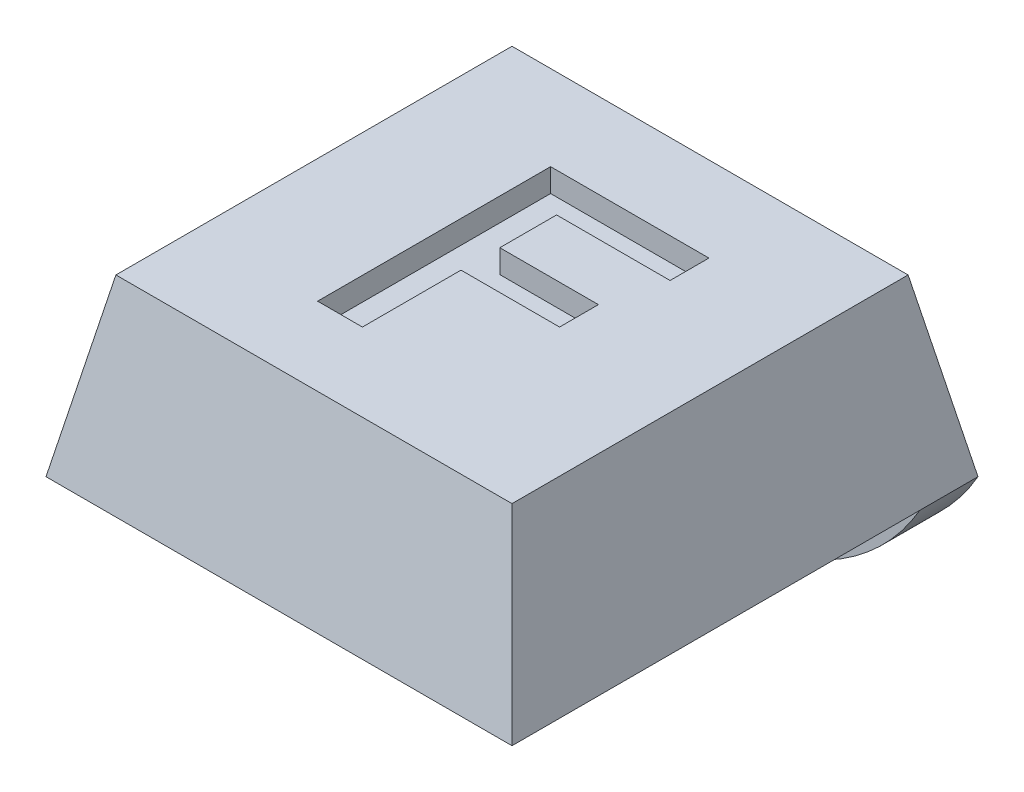
ISO-10303-21;
HEADER;
FILE_DESCRIPTION(('STEP AP214'),'2;1');
FILE_NAME('part.step','',(''),(''),'','','');
FILE_SCHEMA(('AUTOMOTIVE_DESIGN { 1 0 10303 214 1 1 1 1 }'));
ENDSEC;
DATA;
#1=APPLICATION_CONTEXT('core data for automotive mechanical design processes');
#2=APPLICATION_PROTOCOL_DEFINITION('international standard','automotive_design',2000,#1);
#3=PRODUCT_CONTEXT('',#1,'mechanical');
#4=PRODUCT('Part','Part','',(#3));
#5=PRODUCT_RELATED_PRODUCT_CATEGORY('part','',(#4));
#6=PRODUCT_DEFINITION_FORMATION('','',#4);
#7=PRODUCT_DEFINITION_CONTEXT('part definition',#1,'design');
#8=PRODUCT_DEFINITION('design','',#6,#7);
#9=PRODUCT_DEFINITION_SHAPE('','',#8);
#10=(LENGTH_UNIT() NAMED_UNIT(*) SI_UNIT(.MILLI.,.METRE.));
#11=(NAMED_UNIT(*) PLANE_ANGLE_UNIT() SI_UNIT($,.RADIAN.));
#12=(NAMED_UNIT(*) SI_UNIT($,.STERADIAN.) SOLID_ANGLE_UNIT());
#13=UNCERTAINTY_MEASURE_WITH_UNIT(LENGTH_MEASURE(1.E-05),#10,'distance_accuracy_value','');
#14=(GEOMETRIC_REPRESENTATION_CONTEXT(3) GLOBAL_UNCERTAINTY_ASSIGNED_CONTEXT((#13)) GLOBAL_UNIT_ASSIGNED_CONTEXT((#10,
#11,#12)) REPRESENTATION_CONTEXT('',''));
#15=CARTESIAN_POINT('',(0.,0.,0.));
#16=DIRECTION('',(0.,0.,1.));
#17=DIRECTION('',(1.,0.,0.));
#18=AXIS2_PLACEMENT_3D('',#15,#16,#17);
#19=CARTESIAN_POINT('',(0.,3.,0.));
#20=DIRECTION('',(0.,-1.,0.));
#21=DIRECTION('',(0.,0.,-1.));
#22=AXIS2_PLACEMENT_3D('',#19,#20,#21);
#23=PLANE('',#22);
#24=DIRECTION('',(-1.,0.,0.));
#25=VECTOR('',#24,1.);
#26=CARTESIAN_POINT('',(11.,3.,-0.6));
#27=LINE('',#26,#25);
#28=CARTESIAN_POINT('',(7.4,3.,-0.6));
#29=VERTEX_POINT('',#28);
#30=CARTESIAN_POINT('',(0.6,3.,-0.6));
#31=VERTEX_POINT('',#30);
#32=EDGE_CURVE('E217',#29,#31,#27,.T.);
#33=ORIENTED_EDGE('',*,*,#32,.F.);
#34=DIRECTION('',(0.,0.,1.));
#35=VECTOR('',#34,1.);
#36=CARTESIAN_POINT('',(7.4,3.,-8.));
#37=LINE('',#36,#35);
#38=CARTESIAN_POINT('',(7.4,3.,-7.4));
#39=VERTEX_POINT('',#38);
#40=EDGE_CURVE('E230',#39,#29,#37,.T.);
#41=ORIENTED_EDGE('',*,*,#40,.F.);
#42=DIRECTION('',(-1.,0.,0.));
#43=VECTOR('',#42,1.);
#44=CARTESIAN_POINT('',(11.,3.,-7.4));
#45=LINE('',#44,#43);
#46=CARTESIAN_POINT('',(0.599999999999999,3.,-7.4));
#47=VERTEX_POINT('',#46);
#48=EDGE_CURVE('E213',#39,#47,#45,.T.);
#49=ORIENTED_EDGE('',*,*,#48,.T.);
#50=DIRECTION('',(0.,0.,1.));
#51=VECTOR('',#50,1.);
#52=CARTESIAN_POINT('',(0.6,3.,-8.));
#53=LINE('',#52,#51);
#54=EDGE_CURVE('E233',#47,#31,#53,.T.);
#55=ORIENTED_EDGE('',*,*,#54,.T.);
#56=EDGE_LOOP('',(#33,#41,#49,#55));
#57=FACE_BOUND('',#56,.T.);
#58=DIRECTION('',(-1.,0.,0.));
#59=VECTOR('',#58,1.);
#60=CARTESIAN_POINT('',(3.49080595744267,3.,-1.94116936627452));
#61=LINE('',#60,#59);
#62=CARTESIAN_POINT('',(3.49080595744267,3.,-1.94116936627452));
#63=VERTEX_POINT('',#62);
#64=CARTESIAN_POINT('',(2.7215751882119,3.,-1.94116936627452));
#65=VERTEX_POINT('',#64);
#66=EDGE_CURVE('E58',#63,#65,#61,.T.);
#67=ORIENTED_EDGE('',*,*,#66,.T.);
#68=DIRECTION('',(0.,0.,-1.));
#69=VECTOR('',#68,1.);
#70=CARTESIAN_POINT('',(2.7215751882119,3.,-1.94116936627452));
#71=LINE('',#70,#69);
#72=CARTESIAN_POINT('',(2.7215751882119,3.,-5.94116936627452));
#73=VERTEX_POINT('',#72);
#74=EDGE_CURVE('E185',#65,#73,#71,.T.);
#75=ORIENTED_EDGE('',*,*,#74,.T.);
#76=DIRECTION('',(1.,0.,0.));
#77=VECTOR('',#76,1.);
#78=CARTESIAN_POINT('',(2.7215751882119,3.,-5.94116936627452));
#79=LINE('',#78,#77);
#80=CARTESIAN_POINT('',(5.43952390616062,3.,-5.94116936627452));
#81=VERTEX_POINT('',#80);
#82=EDGE_CURVE('E624',#73,#81,#79,.T.);
#83=ORIENTED_EDGE('',*,*,#82,.T.);
#84=DIRECTION('',(0.,0.,1.));
#85=VECTOR('',#84,1.);
#86=CARTESIAN_POINT('',(5.43952390616062,3.,-5.94116936627452));
#87=LINE('',#86,#85);
#88=CARTESIAN_POINT('',(5.43952390616062,3.,-5.27450269960785));
#89=VERTEX_POINT('',#88);
#90=EDGE_CURVE('E626',#81,#89,#87,.T.);
#91=ORIENTED_EDGE('',*,*,#90,.T.);
#92=DIRECTION('',(-1.,0.,0.));
#93=VECTOR('',#92,1.);
#94=CARTESIAN_POINT('',(5.43952390616062,3.,-5.27450269960785));
#95=LINE('',#94,#93);
#96=CARTESIAN_POINT('',(3.49080595744267,3.,-5.27450269960785));
#97=VERTEX_POINT('',#96);
#98=EDGE_CURVE('E631',#89,#97,#95,.T.);
#99=ORIENTED_EDGE('',*,*,#98,.T.);
#100=DIRECTION('',(0.,0.,1.));
#101=VECTOR('',#100,1.);
#102=CARTESIAN_POINT('',(3.49080595744267,3.,-5.27450269960785));
#103=LINE('',#102,#101);
#104=CARTESIAN_POINT('',(3.49080595744267,3.,-4.30014372524888));
#105=VERTEX_POINT('',#104);
#106=EDGE_CURVE('E641',#97,#105,#103,.T.);
#107=ORIENTED_EDGE('',*,*,#106,.T.);
#108=DIRECTION('',(1.,0.,0.));
#109=VECTOR('',#108,1.);
#110=CARTESIAN_POINT('',(3.49080595744267,3.,-4.30014372524888));
#111=LINE('',#110,#109);
#112=CARTESIAN_POINT('',(5.18311364975036,3.,-4.30014372524888));
#113=VERTEX_POINT('',#112);
#114=EDGE_CURVE('E596',#105,#113,#111,.T.);
#115=ORIENTED_EDGE('',*,*,#114,.T.);
#116=DIRECTION('',(0.,0.,1.));
#117=VECTOR('',#116,1.);
#118=CARTESIAN_POINT('',(5.18311364975036,3.,-4.30014372524888));
#119=LINE('',#118,#117);
#120=CARTESIAN_POINT('',(5.18311364975036,3.,-3.63347705858221));
#121=VERTEX_POINT('',#120);
#122=EDGE_CURVE('E591',#113,#121,#119,.T.);
#123=ORIENTED_EDGE('',*,*,#122,.T.);
#124=DIRECTION('',(-1.,0.,0.));
#125=VECTOR('',#124,1.);
#126=CARTESIAN_POINT('',(5.18311364975036,3.,-3.63347705858221));
#127=LINE('',#126,#125);
#128=CARTESIAN_POINT('',(3.49080595744267,3.,-3.63347705858221));
#129=VERTEX_POINT('',#128);
#130=EDGE_CURVE('E585',#121,#129,#127,.T.);
#131=ORIENTED_EDGE('',*,*,#130,.T.);
#132=DIRECTION('',(0.,0.,1.));
#133=VECTOR('',#132,1.);
#134=CARTESIAN_POINT('',(3.49080595744267,3.,-3.63347705858221));
#135=LINE('',#134,#133);
#136=EDGE_CURVE('E181',#129,#63,#135,.T.);
#137=ORIENTED_EDGE('',*,*,#136,.T.);
#138=EDGE_LOOP('',(#67,#75,#83,#91,#99,#107,#115,#123,#131,#137));
#139=FACE_BOUND('',#138,.T.);
#140=ADVANCED_FACE('F42',(#57,#139),#23,.F.);
#141=CARTESIAN_POINT('',(8.,0.,-8.));
#142=DIRECTION('',(-0.98058067569092,-0.196116135138184,0.));
#143=DIRECTION('',(0.196116135138184,-0.98058067569092,0.));
#144=AXIS2_PLACEMENT_3D('',#141,#142,#143);
#145=PLANE('',#144);
#146=DIRECTION('',(-0.192450089729875,0.962250448649376,-0.192450089729875));
#147=VECTOR('',#146,1.);
#148=CARTESIAN_POINT('',(7.7037037037037,1.48148148148148,-0.296296296296296));
#149=LINE('',#148,#147);
#150=CARTESIAN_POINT('',(8.,0.,0.));
#151=VERTEX_POINT('',#150);
#152=EDGE_CURVE('E227',#151,#29,#149,.T.);
#153=ORIENTED_EDGE('',*,*,#152,.F.);
#154=DIRECTION('',(0.,0.,-1.));
#155=VECTOR('',#154,1.);
#156=CARTESIAN_POINT('',(8.,0.,0.));
#157=LINE('',#156,#155);
#158=CARTESIAN_POINT('',(8.,0.,-7.));
#159=VERTEX_POINT('',#158);
#160=EDGE_CURVE('E246',#151,#159,#157,.T.);
#161=ORIENTED_EDGE('',*,*,#160,.T.);
#162=DIRECTION('',(0.,0.,1.));
#163=VECTOR('',#162,1.);
#164=CARTESIAN_POINT('',(8.,0.,-8.));
#165=LINE('',#164,#163);
#166=CARTESIAN_POINT('',(8.,0.,-8.));
#167=VERTEX_POINT('',#166);
#168=EDGE_CURVE('E187',#167,#159,#165,.T.);
#169=ORIENTED_EDGE('',*,*,#168,.F.);
#170=DIRECTION('',(0.192450089729875,-0.962250448649376,-0.192450089729875));
#171=VECTOR('',#170,1.);
#172=CARTESIAN_POINT('',(8.,0.,-8.));
#173=LINE('',#172,#171);
#174=EDGE_CURVE('E220',#39,#167,#173,.T.);
#175=ORIENTED_EDGE('',*,*,#174,.F.);
#176=ORIENTED_EDGE('',*,*,#40,.T.);
#177=EDGE_LOOP('',(#153,#161,#169,#175,#176));
#178=FACE_BOUND('',#177,.T.);
#179=ADVANCED_FACE('F314',(#178),#145,.F.);
#180=CARTESIAN_POINT('',(0.,0.,-8.));
#181=DIRECTION('',(0.98058067569092,-0.196116135138184,0.));
#182=DIRECTION('',(0.196116135138184,0.98058067569092,0.));
#183=AXIS2_PLACEMENT_3D('',#180,#181,#182);
#184=PLANE('',#183);
#185=DIRECTION('',(-0.192450089729875,-0.962250448649376,0.192450089729875));
#186=VECTOR('',#185,1.);
#187=CARTESIAN_POINT('',(0.296296296296296,1.48148148148148,-0.296296296296296));
#188=LINE('',#187,#186);
#189=CARTESIAN_POINT('',(0.,0.,0.));
#190=VERTEX_POINT('',#189);
#191=EDGE_CURVE('E274',#31,#190,#188,.T.);
#192=ORIENTED_EDGE('',*,*,#191,.F.);
#193=ORIENTED_EDGE('',*,*,#54,.F.);
#194=DIRECTION('',(0.192450089729875,0.962250448649376,0.192450089729875));
#195=VECTOR('',#194,1.);
#196=CARTESIAN_POINT('',(0.,0.,-8.));
#197=LINE('',#196,#195);
#198=CARTESIAN_POINT('',(0.,0.,-8.));
#199=VERTEX_POINT('',#198);
#200=EDGE_CURVE('E245',#199,#47,#197,.T.);
#201=ORIENTED_EDGE('',*,*,#200,.F.);
#202=DIRECTION('',(0.,0.,1.));
#203=VECTOR('',#202,1.);
#204=CARTESIAN_POINT('',(0.,0.,0.));
#205=LINE('',#204,#203);
#206=CARTESIAN_POINT('',(0.,0.,-7.));
#207=VERTEX_POINT('',#206);
#208=EDGE_CURVE('E250',#199,#207,#205,.T.);
#209=ORIENTED_EDGE('',*,*,#208,.T.);
#210=EDGE_CURVE('E237',#207,#190,#205,.T.);
#211=ORIENTED_EDGE('',*,*,#210,.T.);
#212=EDGE_LOOP('',(#192,#193,#201,#209,#211));
#213=FACE_BOUND('',#212,.T.);
#214=ADVANCED_FACE('F298',(#213),#184,.F.);
#215=CARTESIAN_POINT('',(0.,0.,0.));
#216=DIRECTION('',(0.,-1.,0.));
#217=DIRECTION('',(0.,0.,-1.));
#218=AXIS2_PLACEMENT_3D('',#215,#216,#217);
#219=PLANE('',#218);
#220=DIRECTION('',(-1.,0.,0.));
#221=VECTOR('',#220,1.);
#222=CARTESIAN_POINT('',(0.,0.,-7.));
#223=LINE('',#222,#221);
#224=EDGE_CURVE('E193',#159,#207,#223,.T.);
#225=ORIENTED_EDGE('',*,*,#224,.F.);
#226=ORIENTED_EDGE('',*,*,#160,.F.);
#227=DIRECTION('',(1.,0.,0.));
#228=VECTOR('',#227,1.);
#229=CARTESIAN_POINT('',(0.,0.,0.));
#230=LINE('',#229,#228);
#231=EDGE_CURVE('E247',#190,#151,#230,.T.);
#232=ORIENTED_EDGE('',*,*,#231,.F.);
#233=ORIENTED_EDGE('',*,*,#210,.F.);
#234=EDGE_LOOP('',(#225,#226,#232,#233));
#235=FACE_BOUND('',#234,.T.);
#236=CARTESIAN_POINT('',(4.,0.,-3.75));
#237=DIRECTION('',(0.,-1.,0.));
#238=DIRECTION('',(0.,0.,-1.));
#239=AXIS2_PLACEMENT_3D('',#236,#237,#238);
#240=CIRCLE('',#239,1.8);
#241=CARTESIAN_POINT('',(4.,0.,-5.55));
#242=VERTEX_POINT('',#241);
#243=EDGE_CURVE('E205',#242,#242,#240,.T.);
#244=ORIENTED_EDGE('',*,*,#243,.F.);
#245=EDGE_LOOP('',(#244));
#246=FACE_BOUND('',#245,.T.);
#247=ADVANCED_FACE('F309',(#235,#246),#219,.T.);
#248=CARTESIAN_POINT('',(11.,3.,-7.4));
#249=DIRECTION('',(0.,0.196116135138184,-0.98058067569092));
#250=DIRECTION('',(0.,0.98058067569092,0.196116135138184));
#251=AXIS2_PLACEMENT_3D('',#248,#249,#250);
#252=PLANE('',#251);
#253=ORIENTED_EDGE('',*,*,#174,.T.);
#254=DIRECTION('',(-1.,0.,0.));
#255=VECTOR('',#254,1.);
#256=CARTESIAN_POINT('',(0.,0.,-8.));
#257=LINE('',#256,#255);
#258=EDGE_CURVE('E241',#167,#199,#257,.T.);
#259=ORIENTED_EDGE('',*,*,#258,.T.);
#260=ORIENTED_EDGE('',*,*,#200,.T.);
#261=ORIENTED_EDGE('',*,*,#48,.F.);
#262=EDGE_LOOP('',(#253,#259,#260,#261));
#263=FACE_BOUND('',#262,.T.);
#264=ADVANCED_FACE('F293',(#263),#252,.T.);
#265=CARTESIAN_POINT('',(11.,0.,0.));
#266=DIRECTION('',(0.,0.196116135138184,0.98058067569092));
#267=DIRECTION('',(0.,-0.98058067569092,0.196116135138184));
#268=AXIS2_PLACEMENT_3D('',#265,#266,#267);
#269=PLANE('',#268);
#270=ORIENTED_EDGE('',*,*,#152,.T.);
#271=ORIENTED_EDGE('',*,*,#32,.T.);
#272=ORIENTED_EDGE('',*,*,#191,.T.);
#273=ORIENTED_EDGE('',*,*,#231,.T.);
#274=EDGE_LOOP('',(#270,#271,#272,#273));
#275=FACE_BOUND('',#274,.T.);
#276=ADVANCED_FACE('F340',(#275),#269,.T.);
#277=CARTESIAN_POINT('',(4.,0.8,-3.75));
#278=DIRECTION('',(0.,-1.,0.));
#279=DIRECTION('',(0.,0.,-1.));
#280=AXIS2_PLACEMENT_3D('',#277,#278,#279);
#281=CYLINDRICAL_SURFACE('',#280,1.8);
#282=CARTESIAN_POINT('',(4.,0.8,-3.75));
#283=DIRECTION('',(0.,-1.,0.));
#284=DIRECTION('',(0.,0.,-1.));
#285=AXIS2_PLACEMENT_3D('',#282,#283,#284);
#286=CIRCLE('',#285,1.8);
#287=CARTESIAN_POINT('',(4.,0.8,-5.55));
#288=VERTEX_POINT('',#287);
#289=EDGE_CURVE('E209',#288,#288,#286,.T.);
#290=ORIENTED_EDGE('',*,*,#289,.F.);
#291=EDGE_LOOP('',(#290));
#292=FACE_BOUND('',#291,.T.);
#293=ORIENTED_EDGE('',*,*,#243,.T.);
#294=EDGE_LOOP('',(#293));
#295=FACE_BOUND('',#294,.T.);
#296=ADVANCED_FACE('F347',(#292,#295),#281,.F.);
#297=CARTESIAN_POINT('',(4.,0.8,-3.75));
#298=DIRECTION('',(0.,-1.,0.));
#299=DIRECTION('',(0.,0.,-1.));
#300=AXIS2_PLACEMENT_3D('',#297,#298,#299);
#301=PLANE('',#300);
#302=ORIENTED_EDGE('',*,*,#289,.T.);
#303=EDGE_LOOP('',(#302));
#304=FACE_BOUND('',#303,.T.);
#305=ADVANCED_FACE('F351',(#304),#301,.T.);
#306=CARTESIAN_POINT('',(0.,-2.,-8.));
#307=DIRECTION('',(0.,0.,1.));
#308=DIRECTION('',(1.,0.,0.));
#309=AXIS2_PLACEMENT_3D('',#306,#307,#308);
#310=PLANE('',#309);
#311=ORIENTED_EDGE('',*,*,#258,.F.);
#312=CARTESIAN_POINT('',(4.53589838486225,2.,-8.));
#313=DIRECTION('',(0.,0.,1.));
#314=DIRECTION('',(1.,0.,0.));
#315=AXIS2_PLACEMENT_3D('',#312,#313,#314);
#316=CIRCLE('',#315,4.);
#317=CARTESIAN_POINT('',(4.53589838486225,-2.,-8.));
#318=VERTEX_POINT('',#317);
#319=EDGE_CURVE('E11',#167,#318,#316,.F.);
#320=ORIENTED_EDGE('',*,*,#319,.T.);
#321=DIRECTION('',(1.,0.,0.));
#322=VECTOR('',#321,1.);
#323=CARTESIAN_POINT('',(0.,-2.,-8.));
#324=LINE('',#323,#322);
#325=CARTESIAN_POINT('',(3.46410161513775,-2.,-8.));
#326=VERTEX_POINT('',#325);
#327=EDGE_CURVE('E199',#326,#318,#324,.T.);
#328=ORIENTED_EDGE('',*,*,#327,.F.);
#329=CARTESIAN_POINT('',(3.46410161513775,2.,-8.));
#330=DIRECTION('',(0.,0.,1.));
#331=DIRECTION('',(1.,0.,0.));
#332=AXIS2_PLACEMENT_3D('',#329,#330,#331);
#333=CIRCLE('',#332,4.);
#334=EDGE_CURVE('E51',#326,#199,#333,.F.);
#335=ORIENTED_EDGE('',*,*,#334,.T.);
#336=EDGE_LOOP('',(#311,#320,#328,#335));
#337=FACE_BOUND('',#336,.T.);
#338=ADVANCED_FACE('F286',(#337),#310,.F.);
#339=CARTESIAN_POINT('',(0.,-2.,-7.));
#340=DIRECTION('',(0.,0.,-1.));
#341=DIRECTION('',(-1.,0.,0.));
#342=AXIS2_PLACEMENT_3D('',#339,#340,#341);
#343=PLANE('',#342);
#344=DIRECTION('',(-1.,0.,0.));
#345=VECTOR('',#344,1.);
#346=CARTESIAN_POINT('',(0.,-2.,-7.));
#347=LINE('',#346,#345);
#348=CARTESIAN_POINT('',(4.53589838486225,-2.,-7.));
#349=VERTEX_POINT('',#348);
#350=CARTESIAN_POINT('',(3.46410161513775,-2.,-7.));
#351=VERTEX_POINT('',#350);
#352=EDGE_CURVE('E203',#349,#351,#347,.T.);
#353=ORIENTED_EDGE('',*,*,#352,.F.);
#354=CARTESIAN_POINT('',(4.53589838486225,2.,-7.));
#355=DIRECTION('',(0.,0.,-1.));
#356=DIRECTION('',(-1.,0.,0.));
#357=AXIS2_PLACEMENT_3D('',#354,#355,#356);
#358=CIRCLE('',#357,4.);
#359=EDGE_CURVE('E280',#349,#159,#358,.F.);
#360=ORIENTED_EDGE('',*,*,#359,.T.);
#361=ORIENTED_EDGE('',*,*,#224,.T.);
#362=CARTESIAN_POINT('',(3.46410161513775,2.,-7.));
#363=DIRECTION('',(0.,0.,-1.));
#364=DIRECTION('',(-1.,0.,0.));
#365=AXIS2_PLACEMENT_3D('',#362,#363,#364);
#366=CIRCLE('',#365,4.);
#367=EDGE_CURVE('E66',#207,#351,#366,.F.);
#368=ORIENTED_EDGE('',*,*,#367,.T.);
#369=EDGE_LOOP('',(#353,#360,#361,#368));
#370=FACE_BOUND('',#369,.T.);
#371=ADVANCED_FACE('F304',(#370),#343,.F.);
#372=CARTESIAN_POINT('',(0.,-2.,0.));
#373=DIRECTION('',(0.,1.,0.));
#374=DIRECTION('',(0.,0.,1.));
#375=AXIS2_PLACEMENT_3D('',#372,#373,#374);
#376=PLANE('',#375);
#377=ORIENTED_EDGE('',*,*,#327,.T.);
#378=DIRECTION('',(0.,0.,1.));
#379=VECTOR('',#378,1.);
#380=CARTESIAN_POINT('',(4.53589838486225,-2.,0.));
#381=LINE('',#380,#379);
#382=EDGE_CURVE('E273',#318,#349,#381,.T.);
#383=ORIENTED_EDGE('',*,*,#382,.T.);
#384=ORIENTED_EDGE('',*,*,#352,.T.);
#385=DIRECTION('',(0.,0.,-1.));
#386=VECTOR('',#385,1.);
#387=CARTESIAN_POINT('',(3.46410161513775,-2.,0.));
#388=LINE('',#387,#386);
#389=EDGE_CURVE('E269',#351,#326,#388,.T.);
#390=ORIENTED_EDGE('',*,*,#389,.T.);
#391=EDGE_LOOP('',(#377,#383,#384,#390));
#392=FACE_BOUND('',#391,.T.);
#393=ADVANCED_FACE('F302',(#392),#376,.F.);
#394=CARTESIAN_POINT('',(4.53589838486225,2.,-8.));
#395=DIRECTION('',(0.,0.,1.));
#396=DIRECTION('',(1.,0.,0.));
#397=AXIS2_PLACEMENT_3D('',#394,#395,#396);
#398=CYLINDRICAL_SURFACE('',#397,4.);
#399=ORIENTED_EDGE('',*,*,#319,.F.);
#400=ORIENTED_EDGE('',*,*,#168,.T.);
#401=ORIENTED_EDGE('',*,*,#359,.F.);
#402=ORIENTED_EDGE('',*,*,#382,.F.);
#403=EDGE_LOOP('',(#399,#400,#401,#402));
#404=FACE_BOUND('',#403,.T.);
#405=ADVANCED_FACE('F315',(#404),#398,.T.);
#406=CARTESIAN_POINT('',(3.46410161513775,2.,-8.));
#407=DIRECTION('',(0.,0.,-1.));
#408=DIRECTION('',(-1.,0.,0.));
#409=AXIS2_PLACEMENT_3D('',#406,#407,#408);
#410=CYLINDRICAL_SURFACE('',#409,4.);
#411=ORIENTED_EDGE('',*,*,#367,.F.);
#412=ORIENTED_EDGE('',*,*,#208,.F.);
#413=ORIENTED_EDGE('',*,*,#334,.F.);
#414=ORIENTED_EDGE('',*,*,#389,.F.);
#415=EDGE_LOOP('',(#411,#412,#413,#414));
#416=FACE_BOUND('',#415,.T.);
#417=ADVANCED_FACE('F44',(#416),#410,.T.);
#418=CARTESIAN_POINT('',(3.49080595744267,2.6,-1.94116936627452));
#419=DIRECTION('',(0.,0.,-1.));
#420=DIRECTION('',(-1.,0.,0.));
#421=AXIS2_PLACEMENT_3D('',#418,#419,#420);
#422=PLANE('',#421);
#423=ORIENTED_EDGE('',*,*,#66,.F.);
#424=DIRECTION('',(0.,1.,0.));
#425=VECTOR('',#424,1.);
#426=CARTESIAN_POINT('',(3.49080595744267,2.6,-1.94116936627452));
#427=LINE('',#426,#425);
#428=CARTESIAN_POINT('',(3.49080595744267,2.6,-1.94116936627452));
#429=VERTEX_POINT('',#428);
#430=EDGE_CURVE('E179',#429,#63,#427,.T.);
#431=ORIENTED_EDGE('',*,*,#430,.F.);
#432=DIRECTION('',(-1.,0.,0.));
#433=VECTOR('',#432,1.);
#434=CARTESIAN_POINT('',(3.49080595744267,2.6,-1.94116936627452));
#435=LINE('',#434,#433);
#436=CARTESIAN_POINT('',(2.7215751882119,2.6,-1.94116936627452));
#437=VERTEX_POINT('',#436);
#438=EDGE_CURVE('E169',#429,#437,#435,.T.);
#439=ORIENTED_EDGE('',*,*,#438,.T.);
#440=DIRECTION('',(0.,1.,0.));
#441=VECTOR('',#440,1.);
#442=CARTESIAN_POINT('',(2.7215751882119,2.6,-1.94116936627452));
#443=LINE('',#442,#441);
#444=EDGE_CURVE('E178',#437,#65,#443,.T.);
#445=ORIENTED_EDGE('',*,*,#444,.T.);
#446=EDGE_LOOP('',(#423,#431,#439,#445));
#447=FACE_BOUND('',#446,.T.);
#448=ADVANCED_FACE('F177',(#447),#422,.T.);
#449=CARTESIAN_POINT('',(2.7215751882119,2.6,-1.94116936627452));
#450=DIRECTION('',(1.,0.,0.));
#451=DIRECTION('',(0.,0.,-1.));
#452=AXIS2_PLACEMENT_3D('',#449,#450,#451);
#453=PLANE('',#452);
#454=ORIENTED_EDGE('',*,*,#74,.F.);
#455=ORIENTED_EDGE('',*,*,#444,.F.);
#456=DIRECTION('',(0.,0.,-1.));
#457=VECTOR('',#456,1.);
#458=CARTESIAN_POINT('',(2.7215751882119,2.6,-1.94116936627452));
#459=LINE('',#458,#457);
#460=CARTESIAN_POINT('',(2.7215751882119,2.6,-5.94116936627452));
#461=VERTEX_POINT('',#460);
#462=EDGE_CURVE('E165',#437,#461,#459,.T.);
#463=ORIENTED_EDGE('',*,*,#462,.T.);
#464=DIRECTION('',(0.,1.,0.));
#465=VECTOR('',#464,1.);
#466=CARTESIAN_POINT('',(2.7215751882119,2.6,-5.94116936627452));
#467=LINE('',#466,#465);
#468=EDGE_CURVE('E188',#461,#73,#467,.T.);
#469=ORIENTED_EDGE('',*,*,#468,.T.);
#470=EDGE_LOOP('',(#454,#455,#463,#469));
#471=FACE_BOUND('',#470,.T.);
#472=ADVANCED_FACE('F183',(#471),#453,.T.);
#473=CARTESIAN_POINT('',(2.7215751882119,2.6,-5.94116936627452));
#474=DIRECTION('',(0.,0.,1.));
#475=DIRECTION('',(1.,0.,0.));
#476=AXIS2_PLACEMENT_3D('',#473,#474,#475);
#477=PLANE('',#476);
#478=ORIENTED_EDGE('',*,*,#82,.F.);
#479=ORIENTED_EDGE('',*,*,#468,.F.);
#480=DIRECTION('',(1.,0.,0.));
#481=VECTOR('',#480,1.);
#482=CARTESIAN_POINT('',(2.7215751882119,2.6,-5.94116936627452));
#483=LINE('',#482,#481);
#484=CARTESIAN_POINT('',(5.43952390616062,2.6,-5.94116936627452));
#485=VERTEX_POINT('',#484);
#486=EDGE_CURVE('E171',#461,#485,#483,.T.);
#487=ORIENTED_EDGE('',*,*,#486,.T.);
#488=DIRECTION('',(0.,1.,0.));
#489=VECTOR('',#488,1.);
#490=CARTESIAN_POINT('',(5.43952390616062,2.6,-5.94116936627452));
#491=LINE('',#490,#489);
#492=EDGE_CURVE('E195',#485,#81,#491,.T.);
#493=ORIENTED_EDGE('',*,*,#492,.T.);
#494=EDGE_LOOP('',(#478,#479,#487,#493));
#495=FACE_BOUND('',#494,.T.);
#496=ADVANCED_FACE('F364',(#495),#477,.T.);
#497=CARTESIAN_POINT('',(5.43952390616062,2.6,-5.94116936627452));
#498=DIRECTION('',(-1.,0.,0.));
#499=DIRECTION('',(0.,0.,1.));
#500=AXIS2_PLACEMENT_3D('',#497,#498,#499);
#501=PLANE('',#500);
#502=ORIENTED_EDGE('',*,*,#90,.F.);
#503=ORIENTED_EDGE('',*,*,#492,.F.);
#504=DIRECTION('',(0.,0.,1.));
#505=VECTOR('',#504,1.);
#506=CARTESIAN_POINT('',(5.43952390616062,2.6,-5.94116936627452));
#507=LINE('',#506,#505);
#508=CARTESIAN_POINT('',(5.43952390616062,2.6,-5.27450269960785));
#509=VERTEX_POINT('',#508);
#510=EDGE_CURVE('E671',#485,#509,#507,.T.);
#511=ORIENTED_EDGE('',*,*,#510,.T.);
#512=DIRECTION('',(0.,1.,0.));
#513=VECTOR('',#512,1.);
#514=CARTESIAN_POINT('',(5.43952390616062,2.6,-5.27450269960785));
#515=LINE('',#514,#513);
#516=EDGE_CURVE('E617',#509,#89,#515,.T.);
#517=ORIENTED_EDGE('',*,*,#516,.T.);
#518=EDGE_LOOP('',(#502,#503,#511,#517));
#519=FACE_BOUND('',#518,.T.);
#520=ADVANCED_FACE('F367',(#519),#501,.T.);
#521=CARTESIAN_POINT('',(5.43952390616062,2.6,-5.27450269960785));
#522=DIRECTION('',(0.,0.,-1.));
#523=DIRECTION('',(-1.,0.,0.));
#524=AXIS2_PLACEMENT_3D('',#521,#522,#523);
#525=PLANE('',#524);
#526=ORIENTED_EDGE('',*,*,#98,.F.);
#527=ORIENTED_EDGE('',*,*,#516,.F.);
#528=DIRECTION('',(-1.,0.,0.));
#529=VECTOR('',#528,1.);
#530=CARTESIAN_POINT('',(5.43952390616062,2.6,-5.27450269960785));
#531=LINE('',#530,#529);
#532=CARTESIAN_POINT('',(3.49080595744267,2.6,-5.27450269960785));
#533=VERTEX_POINT('',#532);
#534=EDGE_CURVE('E668',#509,#533,#531,.T.);
#535=ORIENTED_EDGE('',*,*,#534,.T.);
#536=DIRECTION('',(0.,1.,0.));
#537=VECTOR('',#536,1.);
#538=CARTESIAN_POINT('',(3.49080595744267,2.6,-5.27450269960785));
#539=LINE('',#538,#537);
#540=EDGE_CURVE('E614',#533,#97,#539,.T.);
#541=ORIENTED_EDGE('',*,*,#540,.T.);
#542=EDGE_LOOP('',(#526,#527,#535,#541));
#543=FACE_BOUND('',#542,.T.);
#544=ADVANCED_FACE('F371',(#543),#525,.T.);
#545=CARTESIAN_POINT('',(3.49080595744267,2.6,-5.27450269960785));
#546=DIRECTION('',(-1.,0.,0.));
#547=DIRECTION('',(0.,0.,1.));
#548=AXIS2_PLACEMENT_3D('',#545,#546,#547);
#549=PLANE('',#548);
#550=ORIENTED_EDGE('',*,*,#106,.F.);
#551=ORIENTED_EDGE('',*,*,#540,.F.);
#552=DIRECTION('',(0.,0.,1.));
#553=VECTOR('',#552,1.);
#554=CARTESIAN_POINT('',(3.49080595744267,2.6,-5.27450269960785));
#555=LINE('',#554,#553);
#556=CARTESIAN_POINT('',(3.49080595744267,2.6,-4.30014372524888));
#557=VERTEX_POINT('',#556);
#558=EDGE_CURVE('E665',#533,#557,#555,.T.);
#559=ORIENTED_EDGE('',*,*,#558,.T.);
#560=DIRECTION('',(0.,1.,0.));
#561=VECTOR('',#560,1.);
#562=CARTESIAN_POINT('',(3.49080595744267,2.6,-4.30014372524888));
#563=LINE('',#562,#561);
#564=EDGE_CURVE('E611',#557,#105,#563,.T.);
#565=ORIENTED_EDGE('',*,*,#564,.T.);
#566=EDGE_LOOP('',(#550,#551,#559,#565));
#567=FACE_BOUND('',#566,.T.);
#568=ADVANCED_FACE('F375',(#567),#549,.T.);
#569=CARTESIAN_POINT('',(3.49080595744267,2.6,-4.30014372524888));
#570=DIRECTION('',(0.,0.,1.));
#571=DIRECTION('',(1.,0.,0.));
#572=AXIS2_PLACEMENT_3D('',#569,#570,#571);
#573=PLANE('',#572);
#574=ORIENTED_EDGE('',*,*,#114,.F.);
#575=ORIENTED_EDGE('',*,*,#564,.F.);
#576=DIRECTION('',(1.,0.,0.));
#577=VECTOR('',#576,1.);
#578=CARTESIAN_POINT('',(3.49080595744267,2.6,-4.30014372524888));
#579=LINE('',#578,#577);
#580=CARTESIAN_POINT('',(5.18311364975036,2.6,-4.30014372524888));
#581=VERTEX_POINT('',#580);
#582=EDGE_CURVE('E650',#557,#581,#579,.T.);
#583=ORIENTED_EDGE('',*,*,#582,.T.);
#584=DIRECTION('',(0.,1.,0.));
#585=VECTOR('',#584,1.);
#586=CARTESIAN_POINT('',(5.18311364975036,2.6,-4.30014372524888));
#587=LINE('',#586,#585);
#588=EDGE_CURVE('E608',#581,#113,#587,.T.);
#589=ORIENTED_EDGE('',*,*,#588,.T.);
#590=EDGE_LOOP('',(#574,#575,#583,#589));
#591=FACE_BOUND('',#590,.T.);
#592=ADVANCED_FACE('F379',(#591),#573,.T.);
#593=CARTESIAN_POINT('',(5.18311364975036,2.6,-4.30014372524888));
#594=DIRECTION('',(-1.,0.,0.));
#595=DIRECTION('',(0.,0.,1.));
#596=AXIS2_PLACEMENT_3D('',#593,#594,#595);
#597=PLANE('',#596);
#598=ORIENTED_EDGE('',*,*,#122,.F.);
#599=ORIENTED_EDGE('',*,*,#588,.F.);
#600=DIRECTION('',(0.,0.,1.));
#601=VECTOR('',#600,1.);
#602=CARTESIAN_POINT('',(5.18311364975036,2.6,-4.30014372524888));
#603=LINE('',#602,#601);
#604=CARTESIAN_POINT('',(5.18311364975036,2.6,-3.63347705858221));
#605=VERTEX_POINT('',#604);
#606=EDGE_CURVE('E652',#581,#605,#603,.T.);
#607=ORIENTED_EDGE('',*,*,#606,.T.);
#608=DIRECTION('',(0.,1.,0.));
#609=VECTOR('',#608,1.);
#610=CARTESIAN_POINT('',(5.18311364975036,2.6,-3.63347705858221));
#611=LINE('',#610,#609);
#612=EDGE_CURVE('E605',#605,#121,#611,.T.);
#613=ORIENTED_EDGE('',*,*,#612,.T.);
#614=EDGE_LOOP('',(#598,#599,#607,#613));
#615=FACE_BOUND('',#614,.T.);
#616=ADVANCED_FACE('F383',(#615),#597,.T.);
#617=CARTESIAN_POINT('',(5.18311364975036,2.6,-3.63347705858221));
#618=DIRECTION('',(0.,0.,-1.));
#619=DIRECTION('',(-1.,0.,0.));
#620=AXIS2_PLACEMENT_3D('',#617,#618,#619);
#621=PLANE('',#620);
#622=ORIENTED_EDGE('',*,*,#130,.F.);
#623=ORIENTED_EDGE('',*,*,#612,.F.);
#624=DIRECTION('',(-1.,0.,0.));
#625=VECTOR('',#624,1.);
#626=CARTESIAN_POINT('',(5.18311364975036,2.6,-3.63347705858221));
#627=LINE('',#626,#625);
#628=CARTESIAN_POINT('',(3.49080595744267,2.6,-3.63347705858221));
#629=VERTEX_POINT('',#628);
#630=EDGE_CURVE('E654',#605,#629,#627,.T.);
#631=ORIENTED_EDGE('',*,*,#630,.T.);
#632=DIRECTION('',(0.,1.,0.));
#633=VECTOR('',#632,1.);
#634=CARTESIAN_POINT('',(3.49080595744267,2.6,-3.63347705858221));
#635=LINE('',#634,#633);
#636=EDGE_CURVE('E583',#629,#129,#635,.T.);
#637=ORIENTED_EDGE('',*,*,#636,.T.);
#638=EDGE_LOOP('',(#622,#623,#631,#637));
#639=FACE_BOUND('',#638,.T.);
#640=ADVANCED_FACE('F387',(#639),#621,.T.);
#641=CARTESIAN_POINT('',(3.49080595744267,2.6,-3.63347705858221));
#642=DIRECTION('',(-1.,0.,0.));
#643=DIRECTION('',(0.,0.,1.));
#644=AXIS2_PLACEMENT_3D('',#641,#642,#643);
#645=PLANE('',#644);
#646=ORIENTED_EDGE('',*,*,#136,.F.);
#647=ORIENTED_EDGE('',*,*,#636,.F.);
#648=DIRECTION('',(0.,0.,1.));
#649=VECTOR('',#648,1.);
#650=CARTESIAN_POINT('',(3.49080595744267,2.6,-3.63347705858221));
#651=LINE('',#650,#649);
#652=EDGE_CURVE('E602',#629,#429,#651,.T.);
#653=ORIENTED_EDGE('',*,*,#652,.T.);
#654=ORIENTED_EDGE('',*,*,#430,.T.);
#655=EDGE_LOOP('',(#646,#647,#653,#654));
#656=FACE_BOUND('',#655,.T.);
#657=ADVANCED_FACE('F391',(#656),#645,.T.);
#658=CARTESIAN_POINT('',(0.,2.6,0.));
#659=DIRECTION('',(0.,-1.,0.));
#660=DIRECTION('',(0.,0.,-1.));
#661=AXIS2_PLACEMENT_3D('',#658,#659,#660);
#662=PLANE('',#661);
#663=ORIENTED_EDGE('',*,*,#438,.F.);
#664=ORIENTED_EDGE('',*,*,#652,.F.);
#665=ORIENTED_EDGE('',*,*,#630,.F.);
#666=ORIENTED_EDGE('',*,*,#606,.F.);
#667=ORIENTED_EDGE('',*,*,#582,.F.);
#668=ORIENTED_EDGE('',*,*,#558,.F.);
#669=ORIENTED_EDGE('',*,*,#534,.F.);
#670=ORIENTED_EDGE('',*,*,#510,.F.);
#671=ORIENTED_EDGE('',*,*,#486,.F.);
#672=ORIENTED_EDGE('',*,*,#462,.F.);
#673=EDGE_LOOP('',(#663,#664,#665,#666,#667,#668,#669,#670,#671,#672));
#674=FACE_BOUND('',#673,.T.);
#675=ADVANCED_FACE('F167',(#674),#662,.F.);
#676=CLOSED_SHELL('',(#140,#179,#214,#247,#264,#276,#296,#305,#338,#371,#393,#405,#417,#448,
#472,#496,#520,#544,#568,#592,#616,#640,#657,#675));
#677=MANIFOLD_SOLID_BREP('B2',#676);
#678=ADVANCED_BREP_SHAPE_REPRESENTATION('',(#18,#677),#14);
#679=SHAPE_DEFINITION_REPRESENTATION(#9,#678);
ENDSEC;
END-ISO-10303-21;
